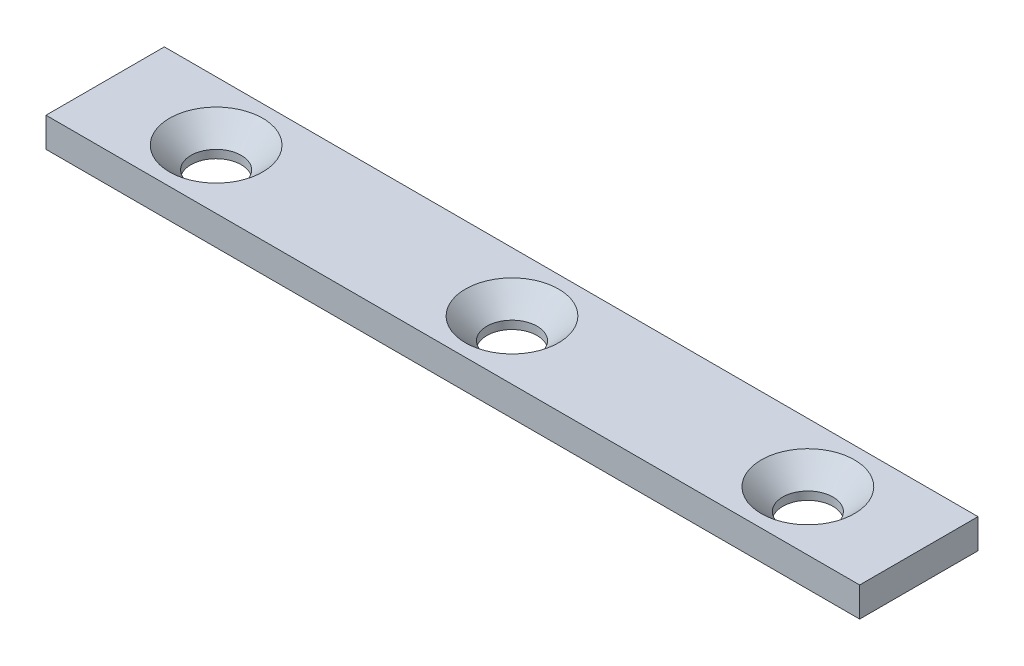
ISO-10303-21;
HEADER;
FILE_DESCRIPTION(('STEP AP214'),'2;1');
FILE_NAME('part.step','',(''),(''),'','','');
FILE_SCHEMA(('AUTOMOTIVE_DESIGN { 1 0 10303 214 1 1 1 1 }'));
ENDSEC;
DATA;
#1=APPLICATION_CONTEXT('core data for automotive mechanical design processes');
#2=APPLICATION_PROTOCOL_DEFINITION('international standard','automotive_design',2000,#1);
#3=PRODUCT_CONTEXT('',#1,'mechanical');
#4=PRODUCT('Part','Part','',(#3));
#5=PRODUCT_RELATED_PRODUCT_CATEGORY('part','',(#4));
#6=PRODUCT_DEFINITION_FORMATION('','',#4);
#7=PRODUCT_DEFINITION_CONTEXT('part definition',#1,'design');
#8=PRODUCT_DEFINITION('design','',#6,#7);
#9=PRODUCT_DEFINITION_SHAPE('','',#8);
#10=(LENGTH_UNIT() NAMED_UNIT(*) SI_UNIT(.MILLI.,.METRE.));
#11=(NAMED_UNIT(*) PLANE_ANGLE_UNIT() SI_UNIT($,.RADIAN.));
#12=(NAMED_UNIT(*) SI_UNIT($,.STERADIAN.) SOLID_ANGLE_UNIT());
#13=UNCERTAINTY_MEASURE_WITH_UNIT(LENGTH_MEASURE(1.E-05),#10,'distance_accuracy_value','');
#14=(GEOMETRIC_REPRESENTATION_CONTEXT(3) GLOBAL_UNCERTAINTY_ASSIGNED_CONTEXT((#13)) GLOBAL_UNIT_ASSIGNED_CONTEXT((#10,
#11,#12)) REPRESENTATION_CONTEXT('',''));
#15=CARTESIAN_POINT('',(0.,0.,0.));
#16=DIRECTION('',(0.,0.,1.));
#17=DIRECTION('',(1.,0.,0.));
#18=AXIS2_PLACEMENT_3D('',#15,#16,#17);
#19=CARTESIAN_POINT('',(-27.5,2.,4.));
#20=DIRECTION('',(1.,0.,0.));
#21=DIRECTION('',(0.,0.,-1.));
#22=AXIS2_PLACEMENT_3D('',#19,#20,#21);
#23=PLANE('',#22);
#24=DIRECTION('',(0.,0.,1.));
#25=VECTOR('',#24,1.);
#26=CARTESIAN_POINT('',(-27.5,0.,4.));
#27=LINE('',#26,#25);
#28=CARTESIAN_POINT('',(-27.5,0.,-4.));
#29=VERTEX_POINT('',#28);
#30=CARTESIAN_POINT('',(-27.5,0.,4.));
#31=VERTEX_POINT('',#30);
#32=EDGE_CURVE('E96',#29,#31,#27,.T.);
#33=ORIENTED_EDGE('',*,*,#32,.T.);
#34=DIRECTION('',(0.,-1.,0.));
#35=VECTOR('',#34,1.);
#36=CARTESIAN_POINT('',(-27.5,2.,4.));
#37=LINE('',#36,#35);
#38=CARTESIAN_POINT('',(-27.5,2.,4.));
#39=VERTEX_POINT('',#38);
#40=EDGE_CURVE('E11',#39,#31,#37,.T.);
#41=ORIENTED_EDGE('',*,*,#40,.F.);
#42=DIRECTION('',(0.,0.,1.));
#43=VECTOR('',#42,1.);
#44=CARTESIAN_POINT('',(-27.5,2.,4.));
#45=LINE('',#44,#43);
#46=CARTESIAN_POINT('',(-27.5,2.,-4.));
#47=VERTEX_POINT('',#46);
#48=EDGE_CURVE('E84',#47,#39,#45,.T.);
#49=ORIENTED_EDGE('',*,*,#48,.F.);
#50=DIRECTION('',(0.,-1.,0.));
#51=VECTOR('',#50,1.);
#52=CARTESIAN_POINT('',(-27.5,2.,-4.));
#53=LINE('',#52,#51);
#54=EDGE_CURVE('E92',#47,#29,#53,.T.);
#55=ORIENTED_EDGE('',*,*,#54,.T.);
#56=EDGE_LOOP('',(#33,#41,#49,#55));
#57=FACE_BOUND('',#56,.T.);
#58=ADVANCED_FACE('F33',(#57),#23,.F.);
#59=CARTESIAN_POINT('',(27.5,2.,4.));
#60=DIRECTION('',(0.,0.,-1.));
#61=DIRECTION('',(-1.,0.,0.));
#62=AXIS2_PLACEMENT_3D('',#59,#60,#61);
#63=PLANE('',#62);
#64=DIRECTION('',(1.,0.,0.));
#65=VECTOR('',#64,1.);
#66=CARTESIAN_POINT('',(27.5,0.,4.));
#67=LINE('',#66,#65);
#68=CARTESIAN_POINT('',(27.5,0.,4.));
#69=VERTEX_POINT('',#68);
#70=EDGE_CURVE('E88',#31,#69,#67,.T.);
#71=ORIENTED_EDGE('',*,*,#70,.T.);
#72=DIRECTION('',(0.,-1.,0.));
#73=VECTOR('',#72,1.);
#74=CARTESIAN_POINT('',(27.5,2.,4.));
#75=LINE('',#74,#73);
#76=CARTESIAN_POINT('',(27.5,2.,4.));
#77=VERTEX_POINT('',#76);
#78=EDGE_CURVE('E41',#77,#69,#75,.T.);
#79=ORIENTED_EDGE('',*,*,#78,.F.);
#80=DIRECTION('',(1.,0.,0.));
#81=VECTOR('',#80,1.);
#82=CARTESIAN_POINT('',(27.5,2.,4.));
#83=LINE('',#82,#81);
#84=EDGE_CURVE('E79',#39,#77,#83,.T.);
#85=ORIENTED_EDGE('',*,*,#84,.F.);
#86=ORIENTED_EDGE('',*,*,#40,.T.);
#87=EDGE_LOOP('',(#71,#79,#85,#86));
#88=FACE_BOUND('',#87,.T.);
#89=ADVANCED_FACE('F87',(#88),#63,.F.);
#90=CARTESIAN_POINT('',(27.5,2.,4.));
#91=DIRECTION('',(-1.,0.,0.));
#92=DIRECTION('',(0.,0.,1.));
#93=AXIS2_PLACEMENT_3D('',#90,#91,#92);
#94=PLANE('',#93);
#95=DIRECTION('',(0.,0.,-1.));
#96=VECTOR('',#95,1.);
#97=CARTESIAN_POINT('',(27.5,0.,4.));
#98=LINE('',#97,#96);
#99=CARTESIAN_POINT('',(27.5,0.,-4.));
#100=VERTEX_POINT('',#99);
#101=EDGE_CURVE('E66',#69,#100,#98,.T.);
#102=ORIENTED_EDGE('',*,*,#101,.T.);
#103=DIRECTION('',(0.,-1.,0.));
#104=VECTOR('',#103,1.);
#105=CARTESIAN_POINT('',(27.5,2.,-4.));
#106=LINE('',#105,#104);
#107=CARTESIAN_POINT('',(27.5,2.,-4.));
#108=VERTEX_POINT('',#107);
#109=EDGE_CURVE('E89',#108,#100,#106,.T.);
#110=ORIENTED_EDGE('',*,*,#109,.F.);
#111=DIRECTION('',(0.,0.,-1.));
#112=VECTOR('',#111,1.);
#113=CARTESIAN_POINT('',(27.5,2.,4.));
#114=LINE('',#113,#112);
#115=EDGE_CURVE('E82',#77,#108,#114,.T.);
#116=ORIENTED_EDGE('',*,*,#115,.F.);
#117=ORIENTED_EDGE('',*,*,#78,.T.);
#118=EDGE_LOOP('',(#102,#110,#116,#117));
#119=FACE_BOUND('',#118,.T.);
#120=ADVANCED_FACE('F90',(#119),#94,.F.);
#121=CARTESIAN_POINT('',(27.5,2.,-4.));
#122=DIRECTION('',(0.,0.,1.));
#123=DIRECTION('',(1.,0.,0.));
#124=AXIS2_PLACEMENT_3D('',#121,#122,#123);
#125=PLANE('',#124);
#126=DIRECTION('',(-1.,0.,0.));
#127=VECTOR('',#126,1.);
#128=CARTESIAN_POINT('',(27.5,0.,-4.));
#129=LINE('',#128,#127);
#130=EDGE_CURVE('E72',#100,#29,#129,.T.);
#131=ORIENTED_EDGE('',*,*,#130,.T.);
#132=ORIENTED_EDGE('',*,*,#54,.F.);
#133=DIRECTION('',(-1.,0.,0.));
#134=VECTOR('',#133,1.);
#135=CARTESIAN_POINT('',(27.5,2.,-4.));
#136=LINE('',#135,#134);
#137=EDGE_CURVE('E49',#108,#47,#136,.T.);
#138=ORIENTED_EDGE('',*,*,#137,.F.);
#139=ORIENTED_EDGE('',*,*,#109,.T.);
#140=EDGE_LOOP('',(#131,#132,#138,#139));
#141=FACE_BOUND('',#140,.T.);
#142=ADVANCED_FACE('F104',(#141),#125,.F.);
#143=CARTESIAN_POINT('',(0.,2.,0.));
#144=DIRECTION('',(0.,1.,0.));
#145=DIRECTION('',(0.,0.,1.));
#146=AXIS2_PLACEMENT_3D('',#143,#144,#145);
#147=PLANE('',#146);
#148=CARTESIAN_POINT('',(20.,2.,0.));
#149=DIRECTION('',(0.,1.,0.));
#150=DIRECTION('',(0.,0.,1.));
#151=AXIS2_PLACEMENT_3D('',#148,#149,#150);
#152=CIRCLE('',#151,3.15);
#153=CARTESIAN_POINT('',(20.,2.,3.15));
#154=VERTEX_POINT('',#153);
#155=EDGE_CURVE('E133',#154,#154,#152,.T.);
#156=ORIENTED_EDGE('',*,*,#155,.F.);
#157=EDGE_LOOP('',(#156));
#158=FACE_BOUND('',#157,.T.);
#159=CARTESIAN_POINT('',(0.,2.,0.));
#160=DIRECTION('',(0.,1.,0.));
#161=DIRECTION('',(0.,0.,1.));
#162=AXIS2_PLACEMENT_3D('',#159,#160,#161);
#163=CIRCLE('',#162,3.15);
#164=CARTESIAN_POINT('',(0.,2.,3.15));
#165=VERTEX_POINT('',#164);
#166=EDGE_CURVE('E124',#165,#165,#163,.T.);
#167=ORIENTED_EDGE('',*,*,#166,.F.);
#168=EDGE_LOOP('',(#167));
#169=FACE_BOUND('',#168,.T.);
#170=CARTESIAN_POINT('',(-20.,2.,0.));
#171=DIRECTION('',(0.,1.,0.));
#172=DIRECTION('',(0.,0.,1.));
#173=AXIS2_PLACEMENT_3D('',#170,#171,#172);
#174=CIRCLE('',#173,3.15);
#175=CARTESIAN_POINT('',(-20.,2.,3.15));
#176=VERTEX_POINT('',#175);
#177=EDGE_CURVE('E115',#176,#176,#174,.T.);
#178=ORIENTED_EDGE('',*,*,#177,.F.);
#179=EDGE_LOOP('',(#178));
#180=FACE_BOUND('',#179,.T.);
#181=ORIENTED_EDGE('',*,*,#48,.T.);
#182=ORIENTED_EDGE('',*,*,#84,.T.);
#183=ORIENTED_EDGE('',*,*,#115,.T.);
#184=ORIENTED_EDGE('',*,*,#137,.T.);
#185=EDGE_LOOP('',(#181,#182,#183,#184));
#186=FACE_BOUND('',#185,.T.);
#187=ADVANCED_FACE('F80',(#158,#169,#180,#186),#147,.T.);
#188=CARTESIAN_POINT('',(0.,0.,0.));
#189=DIRECTION('',(0.,1.,0.));
#190=DIRECTION('',(0.,0.,1.));
#191=AXIS2_PLACEMENT_3D('',#188,#189,#190);
#192=PLANE('',#191);
#193=CARTESIAN_POINT('',(20.,0.,0.));
#194=DIRECTION('',(0.,1.,0.));
#195=DIRECTION('',(0.,0.,1.));
#196=AXIS2_PLACEMENT_3D('',#193,#194,#195);
#197=CIRCLE('',#196,1.7);
#198=CARTESIAN_POINT('',(20.,0.,1.7));
#199=VERTEX_POINT('',#198);
#200=EDGE_CURVE('E127',#199,#199,#197,.T.);
#201=ORIENTED_EDGE('',*,*,#200,.T.);
#202=EDGE_LOOP('',(#201));
#203=FACE_BOUND('',#202,.T.);
#204=CARTESIAN_POINT('',(0.,0.,0.));
#205=DIRECTION('',(0.,1.,0.));
#206=DIRECTION('',(0.,0.,1.));
#207=AXIS2_PLACEMENT_3D('',#204,#205,#206);
#208=CIRCLE('',#207,1.7);
#209=CARTESIAN_POINT('',(0.,0.,1.7));
#210=VERTEX_POINT('',#209);
#211=EDGE_CURVE('E118',#210,#210,#208,.T.);
#212=ORIENTED_EDGE('',*,*,#211,.T.);
#213=EDGE_LOOP('',(#212));
#214=FACE_BOUND('',#213,.T.);
#215=CARTESIAN_POINT('',(-20.,0.,0.));
#216=DIRECTION('',(0.,1.,0.));
#217=DIRECTION('',(0.,0.,1.));
#218=AXIS2_PLACEMENT_3D('',#215,#216,#217);
#219=CIRCLE('',#218,1.7);
#220=CARTESIAN_POINT('',(-20.,0.,1.7));
#221=VERTEX_POINT('',#220);
#222=EDGE_CURVE('E99',#221,#221,#219,.T.);
#223=ORIENTED_EDGE('',*,*,#222,.T.);
#224=EDGE_LOOP('',(#223));
#225=FACE_BOUND('',#224,.T.);
#226=ORIENTED_EDGE('',*,*,#32,.F.);
#227=ORIENTED_EDGE('',*,*,#130,.F.);
#228=ORIENTED_EDGE('',*,*,#101,.F.);
#229=ORIENTED_EDGE('',*,*,#70,.F.);
#230=EDGE_LOOP('',(#226,#227,#228,#229));
#231=FACE_BOUND('',#230,.T.);
#232=ADVANCED_FACE('F107',(#203,#214,#225,#231),#192,.F.);
#233=CARTESIAN_POINT('',(-20.,2.,0.));
#234=DIRECTION('',(0.,1.,0.));
#235=DIRECTION('',(0.,0.,1.));
#236=AXIS2_PLACEMENT_3D('',#233,#234,#235);
#237=CYLINDRICAL_SURFACE('',#236,1.7);
#238=ORIENTED_EDGE('',*,*,#222,.F.);
#239=EDGE_LOOP('',(#238));
#240=FACE_BOUND('',#239,.T.);
#241=CARTESIAN_POINT('',(-20.,0.55,0.));
#242=DIRECTION('',(0.,1.,0.));
#243=DIRECTION('',(0.,0.,1.));
#244=AXIS2_PLACEMENT_3D('',#241,#242,#243);
#245=CIRCLE('',#244,1.7);
#246=CARTESIAN_POINT('',(-20.,0.55,1.7));
#247=VERTEX_POINT('',#246);
#248=EDGE_CURVE('E112',#247,#247,#245,.T.);
#249=ORIENTED_EDGE('',*,*,#248,.T.);
#250=EDGE_LOOP('',(#249));
#251=FACE_BOUND('',#250,.T.);
#252=ADVANCED_FACE('F149',(#240,#251),#237,.F.);
#253=CARTESIAN_POINT('',(-20.,2.,0.));
#254=DIRECTION('',(0.,1.,0.));
#255=DIRECTION('',(0.,0.,1.));
#256=AXIS2_PLACEMENT_3D('',#253,#254,#255);
#257=CONICAL_SURFACE('',#256,3.15,0.785398163397448);
#258=ORIENTED_EDGE('',*,*,#248,.F.);
#259=EDGE_LOOP('',(#258));
#260=FACE_BOUND('',#259,.T.);
#261=ORIENTED_EDGE('',*,*,#177,.T.);
#262=EDGE_LOOP('',(#261));
#263=FACE_BOUND('',#262,.T.);
#264=ADVANCED_FACE('F146',(#260,#263),#257,.F.);
#265=CARTESIAN_POINT('',(0.,2.,0.));
#266=DIRECTION('',(0.,1.,0.));
#267=DIRECTION('',(0.,0.,1.));
#268=AXIS2_PLACEMENT_3D('',#265,#266,#267);
#269=CYLINDRICAL_SURFACE('',#268,1.7);
#270=ORIENTED_EDGE('',*,*,#211,.F.);
#271=EDGE_LOOP('',(#270));
#272=FACE_BOUND('',#271,.T.);
#273=CARTESIAN_POINT('',(0.,0.55,0.));
#274=DIRECTION('',(0.,1.,0.));
#275=DIRECTION('',(0.,0.,1.));
#276=AXIS2_PLACEMENT_3D('',#273,#274,#275);
#277=CIRCLE('',#276,1.7);
#278=CARTESIAN_POINT('',(0.,0.55,1.7));
#279=VERTEX_POINT('',#278);
#280=EDGE_CURVE('E121',#279,#279,#277,.T.);
#281=ORIENTED_EDGE('',*,*,#280,.T.);
#282=EDGE_LOOP('',(#281));
#283=FACE_BOUND('',#282,.T.);
#284=ADVANCED_FACE('F148',(#272,#283),#269,.F.);
#285=CARTESIAN_POINT('',(0.,2.,0.));
#286=DIRECTION('',(0.,1.,0.));
#287=DIRECTION('',(0.,0.,1.));
#288=AXIS2_PLACEMENT_3D('',#285,#286,#287);
#289=CONICAL_SURFACE('',#288,3.15,0.785398163397448);
#290=ORIENTED_EDGE('',*,*,#280,.F.);
#291=EDGE_LOOP('',(#290));
#292=FACE_BOUND('',#291,.T.);
#293=ORIENTED_EDGE('',*,*,#166,.T.);
#294=EDGE_LOOP('',(#293));
#295=FACE_BOUND('',#294,.T.);
#296=ADVANCED_FACE('F156',(#292,#295),#289,.F.);
#297=CARTESIAN_POINT('',(20.,2.,0.));
#298=DIRECTION('',(0.,1.,0.));
#299=DIRECTION('',(0.,0.,1.));
#300=AXIS2_PLACEMENT_3D('',#297,#298,#299);
#301=CYLINDRICAL_SURFACE('',#300,1.7);
#302=ORIENTED_EDGE('',*,*,#200,.F.);
#303=EDGE_LOOP('',(#302));
#304=FACE_BOUND('',#303,.T.);
#305=CARTESIAN_POINT('',(20.,0.55,0.));
#306=DIRECTION('',(0.,1.,0.));
#307=DIRECTION('',(0.,0.,1.));
#308=AXIS2_PLACEMENT_3D('',#305,#306,#307);
#309=CIRCLE('',#308,1.7);
#310=CARTESIAN_POINT('',(20.,0.55,1.7));
#311=VERTEX_POINT('',#310);
#312=EDGE_CURVE('E130',#311,#311,#309,.T.);
#313=ORIENTED_EDGE('',*,*,#312,.T.);
#314=EDGE_LOOP('',(#313));
#315=FACE_BOUND('',#314,.T.);
#316=ADVANCED_FACE('F188',(#304,#315),#301,.F.);
#317=CARTESIAN_POINT('',(20.,2.,0.));
#318=DIRECTION('',(0.,1.,0.));
#319=DIRECTION('',(0.,0.,1.));
#320=AXIS2_PLACEMENT_3D('',#317,#318,#319);
#321=CONICAL_SURFACE('',#320,3.15,0.785398163397448);
#322=ORIENTED_EDGE('',*,*,#312,.F.);
#323=EDGE_LOOP('',(#322));
#324=FACE_BOUND('',#323,.T.);
#325=ORIENTED_EDGE('',*,*,#155,.T.);
#326=EDGE_LOOP('',(#325));
#327=FACE_BOUND('',#326,.T.);
#328=ADVANCED_FACE('F137',(#324,#327),#321,.F.);
#329=CLOSED_SHELL('',(#58,#89,#120,#142,#187,#232,#252,#264,#284,#296,#316,#328));
#330=MANIFOLD_SOLID_BREP('B2',#329);
#331=ADVANCED_BREP_SHAPE_REPRESENTATION('',(#18,#330),#14);
#332=SHAPE_DEFINITION_REPRESENTATION(#9,#331);
ENDSEC;
END-ISO-10303-21;
